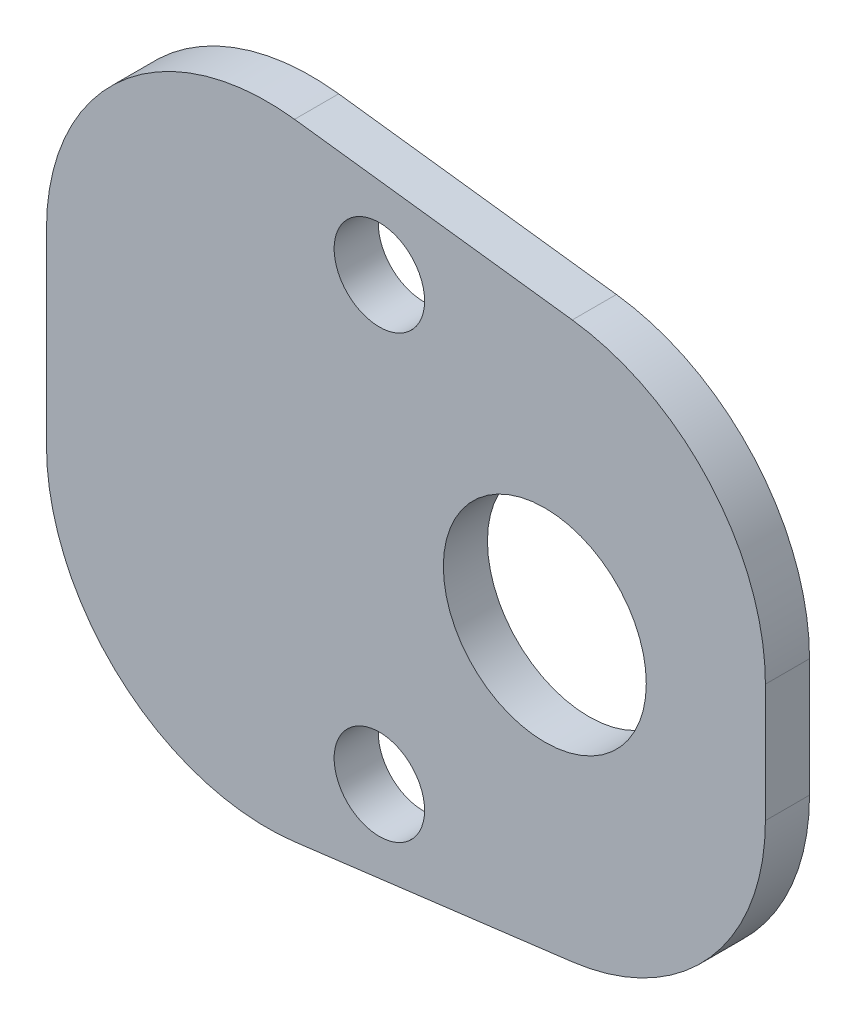
ISO-10303-21;
HEADER;
FILE_DESCRIPTION(('STEP AP214'),'2;1');
FILE_NAME('part.step','',(''),(''),'','','');
FILE_SCHEMA(('AUTOMOTIVE_DESIGN { 1 0 10303 214 1 1 1 1 }'));
ENDSEC;
DATA;
#1=APPLICATION_CONTEXT('core data for automotive mechanical design processes');
#2=APPLICATION_PROTOCOL_DEFINITION('international standard','automotive_design',2000,#1);
#3=PRODUCT_CONTEXT('',#1,'mechanical');
#4=PRODUCT('Part','Part','',(#3));
#5=PRODUCT_RELATED_PRODUCT_CATEGORY('part','',(#4));
#6=PRODUCT_DEFINITION_FORMATION('','',#4);
#7=PRODUCT_DEFINITION_CONTEXT('part definition',#1,'design');
#8=PRODUCT_DEFINITION('design','',#6,#7);
#9=PRODUCT_DEFINITION_SHAPE('','',#8);
#10=(LENGTH_UNIT() NAMED_UNIT(*) SI_UNIT(.MILLI.,.METRE.));
#11=(NAMED_UNIT(*) PLANE_ANGLE_UNIT() SI_UNIT($,.RADIAN.));
#12=(NAMED_UNIT(*) SI_UNIT($,.STERADIAN.) SOLID_ANGLE_UNIT());
#13=UNCERTAINTY_MEASURE_WITH_UNIT(LENGTH_MEASURE(1.E-05),#10,'distance_accuracy_value','');
#14=(GEOMETRIC_REPRESENTATION_CONTEXT(3) GLOBAL_UNCERTAINTY_ASSIGNED_CONTEXT((#13)) GLOBAL_UNIT_ASSIGNED_CONTEXT((#10,
#11,#12)) REPRESENTATION_CONTEXT('',''));
#15=CARTESIAN_POINT('',(0.,0.,0.));
#16=DIRECTION('',(0.,0.,1.));
#17=DIRECTION('',(1.,0.,0.));
#18=AXIS2_PLACEMENT_3D('',#15,#16,#17);
#19=CARTESIAN_POINT('',(-27.5892088648675,0.,2.));
#20=DIRECTION('',(-1.,0.,0.));
#21=DIRECTION('',(0.,0.,1.));
#22=AXIS2_PLACEMENT_3D('',#19,#20,#21);
#23=PLANE('',#22);
#24=DIRECTION('',(0.,1.,0.));
#25=VECTOR('',#24,1.);
#26=CARTESIAN_POINT('',(-27.5892088648675,0.,0.));
#27=LINE('',#26,#25);
#28=CARTESIAN_POINT('',(-27.5892088648675,-4.25908894153826,0.));
#29=VERTEX_POINT('',#28);
#30=CARTESIAN_POINT('',(-27.5892088648675,4.25908894153826,0.));
#31=VERTEX_POINT('',#30);
#32=EDGE_CURVE('E146',#29,#31,#27,.T.);
#33=ORIENTED_EDGE('',*,*,#32,.F.);
#34=DIRECTION('',(0.,0.,-1.));
#35=VECTOR('',#34,1.);
#36=CARTESIAN_POINT('',(-27.5892088648675,-4.25908894153826,2.));
#37=LINE('',#36,#35);
#38=CARTESIAN_POINT('',(-27.5892088648675,-4.25908894153826,2.));
#39=VERTEX_POINT('',#38);
#40=EDGE_CURVE('E11',#39,#29,#37,.T.);
#41=ORIENTED_EDGE('',*,*,#40,.F.);
#42=DIRECTION('',(0.,1.,0.));
#43=VECTOR('',#42,1.);
#44=CARTESIAN_POINT('',(-27.5892088648675,0.,2.));
#45=LINE('',#44,#43);
#46=CARTESIAN_POINT('',(-27.5892088648675,4.25908894153826,2.));
#47=VERTEX_POINT('',#46);
#48=EDGE_CURVE('E190',#39,#47,#45,.T.);
#49=ORIENTED_EDGE('',*,*,#48,.T.);
#50=DIRECTION('',(0.,0.,-1.));
#51=VECTOR('',#50,1.);
#52=CARTESIAN_POINT('',(-27.5892088648675,4.25908894153826,2.));
#53=LINE('',#52,#51);
#54=EDGE_CURVE('E91',#47,#31,#53,.T.);
#55=ORIENTED_EDGE('',*,*,#54,.T.);
#56=EDGE_LOOP('',(#33,#41,#49,#55));
#57=FACE_BOUND('',#56,.T.);
#58=ADVANCED_FACE('F39',(#57),#23,.T.);
#59=CARTESIAN_POINT('',(-17.5892088648675,-4.25908894153834,2.));
#60=DIRECTION('',(0.,0.,-1.));
#61=DIRECTION('',(-1.,0.,0.));
#62=AXIS2_PLACEMENT_3D('',#59,#60,#61);
#63=CYLINDRICAL_SURFACE('',#62,10.);
#64=CARTESIAN_POINT('',(-17.5892088648675,-4.25908894153834,0.));
#65=DIRECTION('',(0.,0.,1.));
#66=DIRECTION('',(1.,0.,0.));
#67=AXIS2_PLACEMENT_3D('',#64,#65,#66);
#68=CIRCLE('',#67,10.);
#69=CARTESIAN_POINT('',(-16.3433106435309,-14.1811722722744,0.));
#70=VERTEX_POINT('',#69);
#71=EDGE_CURVE('E148',#29,#70,#68,.T.);
#72=ORIENTED_EDGE('',*,*,#71,.T.);
#73=DIRECTION('',(0.,0.,-1.));
#74=VECTOR('',#73,1.);
#75=CARTESIAN_POINT('',(-16.3433106435309,-14.1811722722744,2.));
#76=LINE('',#75,#74);
#77=CARTESIAN_POINT('',(-16.3433106435309,-14.1811722722744,2.));
#78=VERTEX_POINT('',#77);
#79=EDGE_CURVE('E48',#78,#70,#76,.T.);
#80=ORIENTED_EDGE('',*,*,#79,.F.);
#81=CARTESIAN_POINT('',(-17.5892088648675,-4.25908894153834,2.));
#82=DIRECTION('',(0.,0.,1.));
#83=DIRECTION('',(1.,0.,0.));
#84=AXIS2_PLACEMENT_3D('',#81,#82,#83);
#85=CIRCLE('',#84,10.);
#86=EDGE_CURVE('E188',#39,#78,#85,.T.);
#87=ORIENTED_EDGE('',*,*,#86,.F.);
#88=ORIENTED_EDGE('',*,*,#40,.T.);
#89=EDGE_LOOP('',(#72,#80,#87,#88));
#90=FACE_BOUND('',#89,.T.);
#91=ADVANCED_FACE('F180',(#90),#63,.T.);
#92=CARTESIAN_POINT('',(1.49937211984162,-11.9406985755969,2.));
#93=DIRECTION('',(0.124589822133646,-0.992208333073607,0.));
#94=DIRECTION('',(0.992208333073607,0.124589822133646,0.));
#95=AXIS2_PLACEMENT_3D('',#92,#93,#94);
#96=PLANE('',#95);
#97=DIRECTION('',(-0.992208333073607,-0.124589822133646,0.));
#98=VECTOR('',#97,1.);
#99=CARTESIAN_POINT('',(1.49937211984162,-11.9406985755969,0.));
#100=LINE('',#99,#98);
#101=CARTESIAN_POINT('',(-3.75309694701218,-12.6002417027692,0.));
#102=VERTEX_POINT('',#101);
#103=EDGE_CURVE('E151',#102,#70,#100,.T.);
#104=ORIENTED_EDGE('',*,*,#103,.F.);
#105=DIRECTION('',(0.,0.,-1.));
#106=VECTOR('',#105,1.);
#107=CARTESIAN_POINT('',(-3.75309694701218,-12.6002417027692,2.));
#108=LINE('',#107,#106);
#109=CARTESIAN_POINT('',(-3.75309694701218,-12.6002417027692,2.));
#110=VERTEX_POINT('',#109);
#111=EDGE_CURVE('E170',#110,#102,#108,.T.);
#112=ORIENTED_EDGE('',*,*,#111,.F.);
#113=DIRECTION('',(-0.992208333073607,-0.124589822133646,0.));
#114=VECTOR('',#113,1.);
#115=CARTESIAN_POINT('',(1.49937211984162,-11.9406985755969,2.));
#116=LINE('',#115,#114);
#117=EDGE_CURVE('E177',#110,#78,#116,.T.);
#118=ORIENTED_EDGE('',*,*,#117,.T.);
#119=ORIENTED_EDGE('',*,*,#79,.T.);
#120=EDGE_LOOP('',(#104,#112,#118,#119));
#121=FACE_BOUND('',#120,.T.);
#122=ADVANCED_FACE('F175',(#121),#96,.T.);
#123=CARTESIAN_POINT('',(-4.99899516834858,-2.67815837203311,2.));
#124=DIRECTION('',(0.,0.,-1.));
#125=DIRECTION('',(-1.,0.,0.));
#126=AXIS2_PLACEMENT_3D('',#123,#124,#125);
#127=CYLINDRICAL_SURFACE('',#126,10.);
#128=CARTESIAN_POINT('',(-4.99899516834858,-2.67815837203311,0.));
#129=DIRECTION('',(0.,0.,1.));
#130=DIRECTION('',(1.,0.,0.));
#131=AXIS2_PLACEMENT_3D('',#128,#129,#130);
#132=CIRCLE('',#131,10.);
#133=CARTESIAN_POINT('',(5.00100483165142,-2.67815837203305,0.));
#134=VERTEX_POINT('',#133);
#135=EDGE_CURVE('E154',#102,#134,#132,.T.);
#136=ORIENTED_EDGE('',*,*,#135,.T.);
#137=DIRECTION('',(0.,0.,-1.));
#138=VECTOR('',#137,1.);
#139=CARTESIAN_POINT('',(5.00100483165142,-2.67815837203305,2.));
#140=LINE('',#139,#138);
#141=CARTESIAN_POINT('',(5.00100483165142,-2.67815837203305,2.));
#142=VERTEX_POINT('',#141);
#143=EDGE_CURVE('E168',#142,#134,#140,.T.);
#144=ORIENTED_EDGE('',*,*,#143,.F.);
#145=CARTESIAN_POINT('',(-4.99899516834858,-2.67815837203311,2.));
#146=DIRECTION('',(0.,0.,1.));
#147=DIRECTION('',(1.,0.,0.));
#148=AXIS2_PLACEMENT_3D('',#145,#146,#147);
#149=CIRCLE('',#148,10.);
#150=EDGE_CURVE('E132',#110,#142,#149,.T.);
#151=ORIENTED_EDGE('',*,*,#150,.F.);
#152=ORIENTED_EDGE('',*,*,#111,.T.);
#153=EDGE_LOOP('',(#136,#144,#151,#152));
#154=FACE_BOUND('',#153,.T.);
#155=ADVANCED_FACE('F186',(#154),#127,.T.);
#156=CARTESIAN_POINT('',(5.00100483165142,0.,2.));
#157=DIRECTION('',(1.,0.,0.));
#158=DIRECTION('',(0.,0.,-1.));
#159=AXIS2_PLACEMENT_3D('',#156,#157,#158);
#160=PLANE('',#159);
#161=DIRECTION('',(0.,-1.,0.));
#162=VECTOR('',#161,1.);
#163=CARTESIAN_POINT('',(5.00100483165142,0.,0.));
#164=LINE('',#163,#162);
#165=CARTESIAN_POINT('',(5.00100483165142,2.67815837203305,0.));
#166=VERTEX_POINT('',#165);
#167=EDGE_CURVE('E157',#166,#134,#164,.T.);
#168=ORIENTED_EDGE('',*,*,#167,.F.);
#169=DIRECTION('',(0.,0.,-1.));
#170=VECTOR('',#169,1.);
#171=CARTESIAN_POINT('',(5.00100483165142,2.67815837203305,2.));
#172=LINE('',#171,#170);
#173=CARTESIAN_POINT('',(5.00100483165142,2.67815837203305,2.));
#174=VERTEX_POINT('',#173);
#175=EDGE_CURVE('E120',#174,#166,#172,.T.);
#176=ORIENTED_EDGE('',*,*,#175,.F.);
#177=DIRECTION('',(0.,-1.,0.));
#178=VECTOR('',#177,1.);
#179=CARTESIAN_POINT('',(5.00100483165142,0.,2.));
#180=LINE('',#179,#178);
#181=EDGE_CURVE('E130',#174,#142,#180,.T.);
#182=ORIENTED_EDGE('',*,*,#181,.T.);
#183=ORIENTED_EDGE('',*,*,#143,.T.);
#184=EDGE_LOOP('',(#168,#176,#182,#183));
#185=FACE_BOUND('',#184,.T.);
#186=ADVANCED_FACE('F252',(#185),#160,.T.);
#187=CARTESIAN_POINT('',(-4.99899516834858,2.67815837203311,2.));
#188=DIRECTION('',(0.,0.,-1.));
#189=DIRECTION('',(-1.,0.,0.));
#190=AXIS2_PLACEMENT_3D('',#187,#188,#189);
#191=CYLINDRICAL_SURFACE('',#190,10.);
#192=CARTESIAN_POINT('',(-4.99899516834858,2.67815837203311,0.));
#193=DIRECTION('',(0.,0.,1.));
#194=DIRECTION('',(1.,0.,0.));
#195=AXIS2_PLACEMENT_3D('',#192,#193,#194);
#196=CIRCLE('',#195,10.);
#197=CARTESIAN_POINT('',(-3.75309694701218,12.6002417027692,0.));
#198=VERTEX_POINT('',#197);
#199=EDGE_CURVE('E117',#198,#166,#196,.F.);
#200=ORIENTED_EDGE('',*,*,#199,.F.);
#201=DIRECTION('',(0.,0.,-1.));
#202=VECTOR('',#201,1.);
#203=CARTESIAN_POINT('',(-3.75309694701218,12.6002417027692,2.));
#204=LINE('',#203,#202);
#205=CARTESIAN_POINT('',(-3.75309694701218,12.6002417027692,2.));
#206=VERTEX_POINT('',#205);
#207=EDGE_CURVE('E111',#206,#198,#204,.T.);
#208=ORIENTED_EDGE('',*,*,#207,.F.);
#209=CARTESIAN_POINT('',(-4.99899516834858,2.67815837203311,2.));
#210=DIRECTION('',(0.,0.,1.));
#211=DIRECTION('',(1.,0.,0.));
#212=AXIS2_PLACEMENT_3D('',#209,#210,#211);
#213=CIRCLE('',#212,10.);
#214=EDGE_CURVE('E115',#206,#174,#213,.F.);
#215=ORIENTED_EDGE('',*,*,#214,.T.);
#216=ORIENTED_EDGE('',*,*,#175,.T.);
#217=EDGE_LOOP('',(#200,#208,#215,#216));
#218=FACE_BOUND('',#217,.T.);
#219=ADVANCED_FACE('F113',(#218),#191,.T.);
#220=CARTESIAN_POINT('',(1.49937211984162,11.9406985755969,2.));
#221=DIRECTION('',(-0.124589822133646,-0.992208333073607,0.));
#222=DIRECTION('',(0.992208333073607,-0.124589822133646,0.));
#223=AXIS2_PLACEMENT_3D('',#220,#221,#222);
#224=PLANE('',#223);
#225=DIRECTION('',(-0.992208333073607,0.124589822133646,0.));
#226=VECTOR('',#225,1.);
#227=CARTESIAN_POINT('',(1.49937211984162,11.9406985755969,0.));
#228=LINE('',#227,#226);
#229=CARTESIAN_POINT('',(-16.3433106435309,14.1811722722744,0.));
#230=VERTEX_POINT('',#229);
#231=EDGE_CURVE('E161',#198,#230,#228,.T.);
#232=ORIENTED_EDGE('',*,*,#231,.T.);
#233=DIRECTION('',(0.,0.,-1.));
#234=VECTOR('',#233,1.);
#235=CARTESIAN_POINT('',(-16.3433106435309,14.1811722722744,2.));
#236=LINE('',#235,#234);
#237=CARTESIAN_POINT('',(-16.3433106435309,14.1811722722744,2.));
#238=VERTEX_POINT('',#237);
#239=EDGE_CURVE('E121',#238,#230,#236,.T.);
#240=ORIENTED_EDGE('',*,*,#239,.F.);
#241=DIRECTION('',(-0.992208333073607,0.124589822133646,0.));
#242=VECTOR('',#241,1.);
#243=CARTESIAN_POINT('',(1.49937211984162,11.9406985755969,2.));
#244=LINE('',#243,#242);
#245=EDGE_CURVE('E124',#206,#238,#244,.T.);
#246=ORIENTED_EDGE('',*,*,#245,.F.);
#247=ORIENTED_EDGE('',*,*,#207,.T.);
#248=EDGE_LOOP('',(#232,#240,#246,#247));
#249=FACE_BOUND('',#248,.T.);
#250=ADVANCED_FACE('F125',(#249),#224,.F.);
#251=CARTESIAN_POINT('',(-12.4989951683486,-10.,2.));
#252=DIRECTION('',(0.,0.,-1.));
#253=DIRECTION('',(-1.,0.,0.));
#254=AXIS2_PLACEMENT_3D('',#251,#252,#253);
#255=CYLINDRICAL_SURFACE('',#254,2.05);
#256=CARTESIAN_POINT('',(-12.4989951683486,-10.,2.));
#257=DIRECTION('',(0.,0.,1.));
#258=DIRECTION('',(1.,0.,0.));
#259=AXIS2_PLACEMENT_3D('',#256,#257,#258);
#260=CIRCLE('',#259,2.05);
#261=CARTESIAN_POINT('',(-10.4489951683486,-10.,2.));
#262=VERTEX_POINT('',#261);
#263=EDGE_CURVE('E194',#262,#262,#260,.T.);
#264=ORIENTED_EDGE('',*,*,#263,.T.);
#265=EDGE_LOOP('',(#264));
#266=FACE_BOUND('',#265,.T.);
#267=CARTESIAN_POINT('',(-12.4989951683486,-10.,0.));
#268=DIRECTION('',(0.,0.,1.));
#269=DIRECTION('',(1.,0.,0.));
#270=AXIS2_PLACEMENT_3D('',#267,#268,#269);
#271=CIRCLE('',#270,2.05);
#272=CARTESIAN_POINT('',(-10.4489951683486,-10.,0.));
#273=VERTEX_POINT('',#272);
#274=EDGE_CURVE('E143',#273,#273,#271,.T.);
#275=ORIENTED_EDGE('',*,*,#274,.F.);
#276=EDGE_LOOP('',(#275));
#277=FACE_BOUND('',#276,.T.);
#278=ADVANCED_FACE('F213',(#266,#277),#255,.F.);
#279=CARTESIAN_POINT('',(-4.99899516834858,0.,2.));
#280=DIRECTION('',(0.,0.,-1.));
#281=DIRECTION('',(-1.,0.,0.));
#282=AXIS2_PLACEMENT_3D('',#279,#280,#281);
#283=CYLINDRICAL_SURFACE('',#282,4.6);
#284=CARTESIAN_POINT('',(-4.99899516834858,0.,2.));
#285=DIRECTION('',(0.,0.,1.));
#286=DIRECTION('',(1.,0.,0.));
#287=AXIS2_PLACEMENT_3D('',#284,#285,#286);
#288=CIRCLE('',#287,4.6);
#289=CARTESIAN_POINT('',(-0.398995168348585,0.,2.));
#290=VERTEX_POINT('',#289);
#291=EDGE_CURVE('E197',#290,#290,#288,.T.);
#292=ORIENTED_EDGE('',*,*,#291,.T.);
#293=EDGE_LOOP('',(#292));
#294=FACE_BOUND('',#293,.T.);
#295=CARTESIAN_POINT('',(-4.99899516834858,0.,0.));
#296=DIRECTION('',(0.,0.,1.));
#297=DIRECTION('',(1.,0.,0.));
#298=AXIS2_PLACEMENT_3D('',#295,#296,#297);
#299=CIRCLE('',#298,4.6);
#300=CARTESIAN_POINT('',(-0.398995168348585,0.,0.));
#301=VERTEX_POINT('',#300);
#302=EDGE_CURVE('E140',#301,#301,#299,.T.);
#303=ORIENTED_EDGE('',*,*,#302,.F.);
#304=EDGE_LOOP('',(#303));
#305=FACE_BOUND('',#304,.T.);
#306=ADVANCED_FACE('F216',(#294,#305),#283,.F.);
#307=CARTESIAN_POINT('',(-12.4989951683486,10.,2.));
#308=DIRECTION('',(0.,0.,-1.));
#309=DIRECTION('',(-1.,0.,0.));
#310=AXIS2_PLACEMENT_3D('',#307,#308,#309);
#311=CYLINDRICAL_SURFACE('',#310,2.05);
#312=CARTESIAN_POINT('',(-12.4989951683486,10.,2.));
#313=DIRECTION('',(0.,0.,1.));
#314=DIRECTION('',(1.,0.,0.));
#315=AXIS2_PLACEMENT_3D('',#312,#313,#314);
#316=CIRCLE('',#315,2.05);
#317=CARTESIAN_POINT('',(-10.4489951683486,10.,2.));
#318=VERTEX_POINT('',#317);
#319=EDGE_CURVE('E164',#318,#318,#316,.T.);
#320=ORIENTED_EDGE('',*,*,#319,.T.);
#321=EDGE_LOOP('',(#320));
#322=FACE_BOUND('',#321,.T.);
#323=CARTESIAN_POINT('',(-12.4989951683486,10.,0.));
#324=DIRECTION('',(0.,0.,1.));
#325=DIRECTION('',(1.,0.,0.));
#326=AXIS2_PLACEMENT_3D('',#323,#324,#325);
#327=CIRCLE('',#326,2.05);
#328=CARTESIAN_POINT('',(-10.4489951683486,10.,0.));
#329=VERTEX_POINT('',#328);
#330=EDGE_CURVE('E137',#329,#329,#327,.T.);
#331=ORIENTED_EDGE('',*,*,#330,.F.);
#332=EDGE_LOOP('',(#331));
#333=FACE_BOUND('',#332,.T.);
#334=ADVANCED_FACE('F41',(#322,#333),#311,.F.);
#335=CARTESIAN_POINT('',(-17.5892088648675,4.25908894153834,2.));
#336=DIRECTION('',(0.,0.,-1.));
#337=DIRECTION('',(-1.,0.,0.));
#338=AXIS2_PLACEMENT_3D('',#335,#336,#337);
#339=CYLINDRICAL_SURFACE('',#338,10.);
#340=CARTESIAN_POINT('',(-17.5892088648675,4.25908894153834,0.));
#341=DIRECTION('',(0.,0.,1.));
#342=DIRECTION('',(1.,0.,0.));
#343=AXIS2_PLACEMENT_3D('',#340,#341,#342);
#344=CIRCLE('',#343,10.);
#345=EDGE_CURVE('E84',#230,#31,#344,.T.);
#346=ORIENTED_EDGE('',*,*,#345,.T.);
#347=ORIENTED_EDGE('',*,*,#54,.F.);
#348=CARTESIAN_POINT('',(-17.5892088648675,4.25908894153834,2.));
#349=DIRECTION('',(0.,0.,1.));
#350=DIRECTION('',(1.,0.,0.));
#351=AXIS2_PLACEMENT_3D('',#348,#349,#350);
#352=CIRCLE('',#351,10.);
#353=EDGE_CURVE('E56',#238,#47,#352,.T.);
#354=ORIENTED_EDGE('',*,*,#353,.F.);
#355=ORIENTED_EDGE('',*,*,#239,.T.);
#356=EDGE_LOOP('',(#346,#347,#354,#355));
#357=FACE_BOUND('',#356,.T.);
#358=ADVANCED_FACE('F207',(#357),#339,.T.);
#359=CARTESIAN_POINT('',(0.,0.,2.));
#360=DIRECTION('',(0.,0.,1.));
#361=DIRECTION('',(1.,0.,0.));
#362=AXIS2_PLACEMENT_3D('',#359,#360,#361);
#363=PLANE('',#362);
#364=ORIENTED_EDGE('',*,*,#319,.F.);
#365=EDGE_LOOP('',(#364));
#366=FACE_BOUND('',#365,.T.);
#367=ORIENTED_EDGE('',*,*,#291,.F.);
#368=EDGE_LOOP('',(#367));
#369=FACE_BOUND('',#368,.T.);
#370=ORIENTED_EDGE('',*,*,#263,.F.);
#371=EDGE_LOOP('',(#370));
#372=FACE_BOUND('',#371,.T.);
#373=ORIENTED_EDGE('',*,*,#48,.F.);
#374=ORIENTED_EDGE('',*,*,#86,.T.);
#375=ORIENTED_EDGE('',*,*,#117,.F.);
#376=ORIENTED_EDGE('',*,*,#150,.T.);
#377=ORIENTED_EDGE('',*,*,#181,.F.);
#378=ORIENTED_EDGE('',*,*,#214,.F.);
#379=ORIENTED_EDGE('',*,*,#245,.T.);
#380=ORIENTED_EDGE('',*,*,#353,.T.);
#381=EDGE_LOOP('',(#373,#374,#375,#376,#377,#378,#379,#380));
#382=FACE_BOUND('',#381,.T.);
#383=ADVANCED_FACE('F128',(#366,#369,#372,#382),#363,.T.);
#384=CARTESIAN_POINT('',(0.,0.,0.));
#385=DIRECTION('',(0.,0.,1.));
#386=DIRECTION('',(1.,0.,0.));
#387=AXIS2_PLACEMENT_3D('',#384,#385,#386);
#388=PLANE('',#387);
#389=ORIENTED_EDGE('',*,*,#330,.T.);
#390=EDGE_LOOP('',(#389));
#391=FACE_BOUND('',#390,.T.);
#392=ORIENTED_EDGE('',*,*,#302,.T.);
#393=EDGE_LOOP('',(#392));
#394=FACE_BOUND('',#393,.T.);
#395=ORIENTED_EDGE('',*,*,#274,.T.);
#396=EDGE_LOOP('',(#395));
#397=FACE_BOUND('',#396,.T.);
#398=ORIENTED_EDGE('',*,*,#32,.T.);
#399=ORIENTED_EDGE('',*,*,#345,.F.);
#400=ORIENTED_EDGE('',*,*,#231,.F.);
#401=ORIENTED_EDGE('',*,*,#199,.T.);
#402=ORIENTED_EDGE('',*,*,#167,.T.);
#403=ORIENTED_EDGE('',*,*,#135,.F.);
#404=ORIENTED_EDGE('',*,*,#103,.T.);
#405=ORIENTED_EDGE('',*,*,#71,.F.);
#406=EDGE_LOOP('',(#398,#399,#400,#401,#402,#403,#404,#405));
#407=FACE_BOUND('',#406,.T.);
#408=ADVANCED_FACE('F182',(#391,#394,#397,#407),#388,.F.);
#409=CLOSED_SHELL('',(#58,#91,#122,#155,#186,#219,#250,#278,#306,#334,#358,#383,#408));
#410=MANIFOLD_SOLID_BREP('B2',#409);
#411=ADVANCED_BREP_SHAPE_REPRESENTATION('',(#18,#410),#14);
#412=SHAPE_DEFINITION_REPRESENTATION(#9,#411);
ENDSEC;
END-ISO-10303-21;
